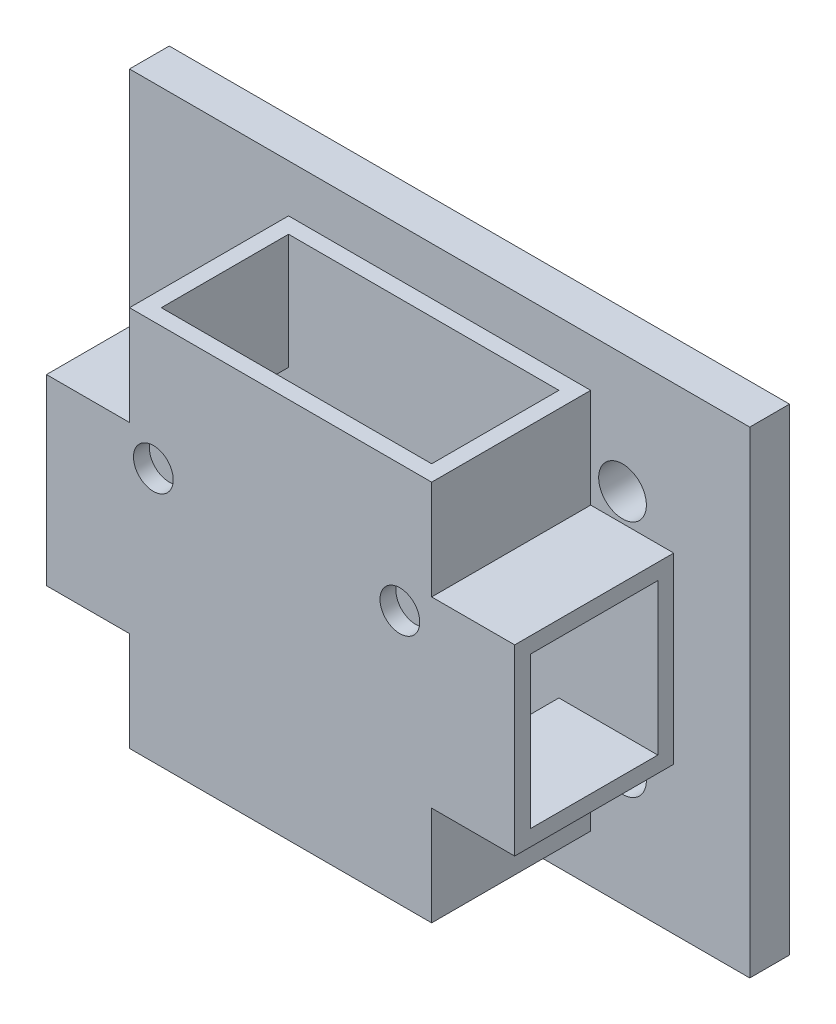
ISO-10303-21;
HEADER;
FILE_DESCRIPTION(('STEP AP214'),'2;1');
FILE_NAME('part.step','',(''),(''),'','','');
FILE_SCHEMA(('AUTOMOTIVE_DESIGN { 1 0 10303 214 1 1 1 1 }'));
ENDSEC;
DATA;
#1=APPLICATION_CONTEXT('core data for automotive mechanical design processes');
#2=APPLICATION_PROTOCOL_DEFINITION('international standard','automotive_design',2000,#1);
#3=PRODUCT_CONTEXT('',#1,'mechanical');
#4=PRODUCT('Part','Part','',(#3));
#5=PRODUCT_RELATED_PRODUCT_CATEGORY('part','',(#4));
#6=PRODUCT_DEFINITION_FORMATION('','',#4);
#7=PRODUCT_DEFINITION_CONTEXT('part definition',#1,'design');
#8=PRODUCT_DEFINITION('design','',#6,#7);
#9=PRODUCT_DEFINITION_SHAPE('','',#8);
#10=(LENGTH_UNIT() NAMED_UNIT(*) SI_UNIT(.MILLI.,.METRE.));
#11=(NAMED_UNIT(*) PLANE_ANGLE_UNIT() SI_UNIT($,.RADIAN.));
#12=(NAMED_UNIT(*) SI_UNIT($,.STERADIAN.) SOLID_ANGLE_UNIT());
#13=UNCERTAINTY_MEASURE_WITH_UNIT(LENGTH_MEASURE(1.E-05),#10,'distance_accuracy_value','');
#14=(GEOMETRIC_REPRESENTATION_CONTEXT(3) GLOBAL_UNCERTAINTY_ASSIGNED_CONTEXT((#13)) GLOBAL_UNIT_ASSIGNED_CONTEXT((#10,
#11,#12)) REPRESENTATION_CONTEXT('',''));
#15=CARTESIAN_POINT('',(0.,0.,0.));
#16=DIRECTION('',(0.,0.,1.));
#17=DIRECTION('',(1.,0.,0.));
#18=AXIS2_PLACEMENT_3D('',#15,#16,#17);
#19=CARTESIAN_POINT('',(30.3481827051708,-0.393732970027243,7.));
#20=DIRECTION('',(0.,-1.,0.));
#21=DIRECTION('',(1.,0.,0.));
#22=AXIS2_PLACEMENT_3D('',#19,#20,#21);
#23=PLANE('',#22);
#24=DIRECTION('',(-1.,0.,0.));
#25=VECTOR('',#24,1.);
#26=CARTESIAN_POINT('',(30.3481827051708,-0.393732970027243,7.));
#27=LINE('',#26,#25);
#28=CARTESIAN_POINT('',(29.2267491749382,-0.393732970027243,7.));
#29=VERTEX_POINT('',#28);
#30=CARTESIAN_POINT('',(16.7874659400545,-0.393732970027254,7.));
#31=VERTEX_POINT('',#30);
#32=EDGE_CURVE('E337',#29,#31,#27,.T.);
#33=ORIENTED_EDGE('',*,*,#32,.T.);
#34=DIRECTION('',(0.,0.,1.));
#35=VECTOR('',#34,1.);
#36=CARTESIAN_POINT('',(16.7874659400545,-0.393732970027245,7.00000000000001));
#37=LINE('',#36,#35);
#38=CARTESIAN_POINT('',(16.7874659400545,-0.393732970027247,23.));
#39=VERTEX_POINT('',#38);
#40=EDGE_CURVE('E313',#31,#39,#37,.T.);
#41=ORIENTED_EDGE('',*,*,#40,.T.);
#42=DIRECTION('',(-1.,0.,0.));
#43=VECTOR('',#42,1.);
#44=CARTESIAN_POINT('',(30.3481827051708,-0.393732970027243,23.));
#45=LINE('',#44,#43);
#46=CARTESIAN_POINT('',(29.2267491749382,-0.393732970027243,23.));
#47=VERTEX_POINT('',#46);
#48=EDGE_CURVE('E332',#47,#39,#45,.T.);
#49=ORIENTED_EDGE('',*,*,#48,.F.);
#50=DIRECTION('',(0.,0.,1.));
#51=VECTOR('',#50,1.);
#52=CARTESIAN_POINT('',(29.2267491749382,-0.393732970027243,25.));
#53=LINE('',#52,#51);
#54=EDGE_CURVE('E484',#29,#47,#53,.T.);
#55=ORIENTED_EDGE('',*,*,#54,.F.);
#56=EDGE_LOOP('',(#33,#41,#49,#55));
#57=FACE_BOUND('',#56,.T.);
#58=ADVANCED_FACE('F38',(#57),#23,.F.);
#59=CARTESIAN_POINT('',(30.3481827051708,18.6062670299728,7.));
#60=DIRECTION('',(0.,1.,0.));
#61=DIRECTION('',(-1.,0.,0.));
#62=AXIS2_PLACEMENT_3D('',#59,#60,#61);
#63=PLANE('',#62);
#64=DIRECTION('',(-1.,0.,0.));
#65=VECTOR('',#64,1.);
#66=CARTESIAN_POINT('',(30.3481827051708,18.6062670299728,23.));
#67=LINE('',#66,#65);
#68=CARTESIAN_POINT('',(29.2267491749382,18.6062670299728,23.));
#69=VERTEX_POINT('',#68);
#70=CARTESIAN_POINT('',(16.7882782751708,18.6062670299728,23.));
#71=VERTEX_POINT('',#70);
#72=EDGE_CURVE('E266',#69,#71,#67,.T.);
#73=ORIENTED_EDGE('',*,*,#72,.T.);
#74=DIRECTION('',(0.,0.,1.));
#75=VECTOR('',#74,1.);
#76=CARTESIAN_POINT('',(16.7882782751708,18.6062670299728,16.));
#77=LINE('',#76,#75);
#78=CARTESIAN_POINT('',(16.7882782751708,18.6062670299728,16.));
#79=VERTEX_POINT('',#78);
#80=EDGE_CURVE('E257',#71,#79,#77,.F.);
#81=ORIENTED_EDGE('',*,*,#80,.T.);
#82=DIRECTION('',(1.,0.,0.));
#83=VECTOR('',#82,1.);
#84=CARTESIAN_POINT('',(30.3481827051708,18.6062670299728,16.));
#85=LINE('',#84,#83);
#86=CARTESIAN_POINT('',(16.7874659400545,18.6062670299727,16.));
#87=VERTEX_POINT('',#86);
#88=EDGE_CURVE('E246',#87,#79,#85,.T.);
#89=ORIENTED_EDGE('',*,*,#88,.F.);
#90=DIRECTION('',(0.,0.,-1.));
#91=VECTOR('',#90,1.);
#92=CARTESIAN_POINT('',(16.7874659400545,18.6062670299728,7.));
#93=LINE('',#92,#91);
#94=CARTESIAN_POINT('',(16.7874659400545,18.6062670299727,7.));
#95=VERTEX_POINT('',#94);
#96=EDGE_CURVE('E493',#87,#95,#93,.T.);
#97=ORIENTED_EDGE('',*,*,#96,.T.);
#98=DIRECTION('',(-1.,0.,0.));
#99=VECTOR('',#98,1.);
#100=CARTESIAN_POINT('',(30.3481827051708,18.6062670299728,7.));
#101=LINE('',#100,#99);
#102=CARTESIAN_POINT('',(29.2267491749382,18.6062670299728,7.));
#103=VERTEX_POINT('',#102);
#104=EDGE_CURVE('E341',#103,#95,#101,.T.);
#105=ORIENTED_EDGE('',*,*,#104,.F.);
#106=DIRECTION('',(0.,0.,-1.));
#107=VECTOR('',#106,1.);
#108=CARTESIAN_POINT('',(29.2267491749382,18.6062670299728,25.));
#109=LINE('',#108,#107);
#110=EDGE_CURVE('E478',#69,#103,#109,.T.);
#111=ORIENTED_EDGE('',*,*,#110,.F.);
#112=EDGE_LOOP('',(#73,#81,#89,#97,#105,#111));
#113=FACE_BOUND('',#112,.T.);
#114=ADVANCED_FACE('F264',(#113),#63,.F.);
#115=CARTESIAN_POINT('',(0.,0.,5.));
#116=DIRECTION('',(0.,0.,1.));
#117=DIRECTION('',(1.,0.,0.));
#118=AXIS2_PLACEMENT_3D('',#115,#116,#117);
#119=PLANE('',#118);
#120=CARTESIAN_POINT('',(-23.2125340599455,24.1062670299727,5.));
#121=DIRECTION('',(0.,0.,1.));
#122=DIRECTION('',(1.,0.,0.));
#123=AXIS2_PLACEMENT_3D('',#120,#121,#122);
#124=CIRCLE('',#123,3.);
#125=CARTESIAN_POINT('',(-20.2125340599455,24.1062670299727,5.));
#126=VERTEX_POINT('',#125);
#127=EDGE_CURVE('E431',#126,#126,#124,.T.);
#128=ORIENTED_EDGE('',*,*,#127,.F.);
#129=EDGE_LOOP('',(#128));
#130=FACE_BOUND('',#129,.T.);
#131=CARTESIAN_POINT('',(22.7874659400545,-5.89373297002725,5.));
#132=DIRECTION('',(0.,0.,1.));
#133=DIRECTION('',(1.,0.,0.));
#134=AXIS2_PLACEMENT_3D('',#131,#132,#133);
#135=CIRCLE('',#134,3.);
#136=CARTESIAN_POINT('',(25.7874659400545,-5.89373297002725,5.));
#137=VERTEX_POINT('',#136);
#138=EDGE_CURVE('E438',#137,#137,#135,.T.);
#139=ORIENTED_EDGE('',*,*,#138,.F.);
#140=EDGE_LOOP('',(#139));
#141=FACE_BOUND('',#140,.T.);
#142=CARTESIAN_POINT('',(-23.2125340599455,-5.89373297002725,5.));
#143=DIRECTION('',(0.,0.,1.));
#144=DIRECTION('',(1.,0.,0.));
#145=AXIS2_PLACEMENT_3D('',#142,#143,#144);
#146=CIRCLE('',#145,3.);
#147=CARTESIAN_POINT('',(-20.2125340599455,-5.89373297002725,5.));
#148=VERTEX_POINT('',#147);
#149=EDGE_CURVE('E425',#148,#148,#146,.T.);
#150=ORIENTED_EDGE('',*,*,#149,.F.);
#151=EDGE_LOOP('',(#150));
#152=FACE_BOUND('',#151,.T.);
#153=CARTESIAN_POINT('',(22.7874659400545,24.1062670299727,5.));
#154=DIRECTION('',(0.,0.,1.));
#155=DIRECTION('',(1.,0.,0.));
#156=AXIS2_PLACEMENT_3D('',#153,#154,#155);
#157=CIRCLE('',#156,3.);
#158=CARTESIAN_POINT('',(25.7874659400545,24.1062670299727,5.));
#159=VERTEX_POINT('',#158);
#160=EDGE_CURVE('E434',#159,#159,#157,.T.);
#161=ORIENTED_EDGE('',*,*,#160,.F.);
#162=EDGE_LOOP('',(#161));
#163=FACE_BOUND('',#162,.T.);
#164=DIRECTION('',(0.,-1.,0.));
#165=VECTOR('',#164,1.);
#166=CARTESIAN_POINT('',(-39.2125340599455,39.1062670299727,5.));
#167=LINE('',#166,#165);
#168=CARTESIAN_POINT('',(-39.2125340599455,39.1062670299727,5.));
#169=VERTEX_POINT('',#168);
#170=CARTESIAN_POINT('',(-39.2125340599455,-20.8937329700273,5.));
#171=VERTEX_POINT('',#170);
#172=EDGE_CURVE('E449',#169,#171,#167,.T.);
#173=ORIENTED_EDGE('',*,*,#172,.T.);
#174=DIRECTION('',(1.,0.,0.));
#175=VECTOR('',#174,1.);
#176=CARTESIAN_POINT('',(-39.2125340599455,-20.8937329700273,5.));
#177=LINE('',#176,#175);
#178=CARTESIAN_POINT('',(38.7874659400545,-20.8937329700273,5.));
#179=VERTEX_POINT('',#178);
#180=EDGE_CURVE('E452',#171,#179,#177,.T.);
#181=ORIENTED_EDGE('',*,*,#180,.T.);
#182=DIRECTION('',(0.,1.,0.));
#183=VECTOR('',#182,1.);
#184=CARTESIAN_POINT('',(38.7874659400545,39.1062670299727,5.));
#185=LINE('',#184,#183);
#186=CARTESIAN_POINT('',(38.7874659400545,39.1062670299727,5.));
#187=VERTEX_POINT('',#186);
#188=EDGE_CURVE('E455',#179,#187,#185,.T.);
#189=ORIENTED_EDGE('',*,*,#188,.T.);
#190=DIRECTION('',(-1.,0.,0.));
#191=VECTOR('',#190,1.);
#192=CARTESIAN_POINT('',(-39.2125340599455,39.1062670299727,5.));
#193=LINE('',#192,#191);
#194=EDGE_CURVE('E457',#187,#169,#193,.T.);
#195=ORIENTED_EDGE('',*,*,#194,.T.);
#196=EDGE_LOOP('',(#173,#181,#189,#195));
#197=FACE_BOUND('',#196,.T.);
#198=DIRECTION('',(0.,1.,0.));
#199=VECTOR('',#198,1.);
#200=CARTESIAN_POINT('',(18.7874659400545,33.1062670299727,5.));
#201=LINE('',#200,#199);
#202=CARTESIAN_POINT('',(18.7874659400545,20.6062670299727,5.));
#203=VERTEX_POINT('',#202);
#204=CARTESIAN_POINT('',(18.7874659400545,33.1062670299727,5.));
#205=VERTEX_POINT('',#204);
#206=EDGE_CURVE('E388',#203,#205,#201,.T.);
#207=ORIENTED_EDGE('',*,*,#206,.F.);
#208=DIRECTION('',(-1.,0.,0.));
#209=VECTOR('',#208,1.);
#210=CARTESIAN_POINT('',(-29.6518172948292,20.6062670299727,5.));
#211=LINE('',#210,#209);
#212=CARTESIAN_POINT('',(29.2267491749382,20.6062670299727,5.));
#213=VERTEX_POINT('',#212);
#214=EDGE_CURVE('E362',#213,#203,#211,.T.);
#215=ORIENTED_EDGE('',*,*,#214,.F.);
#216=DIRECTION('',(0.,1.,0.));
#217=VECTOR('',#216,1.);
#218=CARTESIAN_POINT('',(29.2267491749382,20.6062670299727,5.));
#219=LINE('',#218,#217);
#220=CARTESIAN_POINT('',(29.2267491749382,-2.39373297002725,5.));
#221=VERTEX_POINT('',#220);
#222=EDGE_CURVE('E335',#221,#213,#219,.T.);
#223=ORIENTED_EDGE('',*,*,#222,.F.);
#224=DIRECTION('',(1.,0.,0.));
#225=VECTOR('',#224,1.);
#226=CARTESIAN_POINT('',(-29.6518172948292,-2.39373297002725,5.));
#227=LINE('',#226,#225);
#228=CARTESIAN_POINT('',(18.7874659400545,-2.39373297002725,5.));
#229=VERTEX_POINT('',#228);
#230=EDGE_CURVE('E366',#229,#221,#227,.T.);
#231=ORIENTED_EDGE('',*,*,#230,.F.);
#232=CARTESIAN_POINT('',(18.7874659400545,-14.8937329700273,5.));
#233=VERTEX_POINT('',#232);
#234=EDGE_CURVE('E402',#233,#229,#201,.T.);
#235=ORIENTED_EDGE('',*,*,#234,.F.);
#236=DIRECTION('',(1.,0.,0.));
#237=VECTOR('',#236,1.);
#238=CARTESIAN_POINT('',(-19.2125340599455,-14.8937329700273,5.));
#239=LINE('',#238,#237);
#240=CARTESIAN_POINT('',(-19.2125340599455,-14.8937329700273,5.));
#241=VERTEX_POINT('',#240);
#242=EDGE_CURVE('E411',#241,#233,#239,.T.);
#243=ORIENTED_EDGE('',*,*,#242,.F.);
#244=DIRECTION('',(0.,-1.,0.));
#245=VECTOR('',#244,1.);
#246=CARTESIAN_POINT('',(-19.2125340599455,33.1062670299727,5.));
#247=LINE('',#246,#245);
#248=CARTESIAN_POINT('',(-19.2125340599455,-2.39373297002725,5.));
#249=VERTEX_POINT('',#248);
#250=EDGE_CURVE('E407',#249,#241,#247,.T.);
#251=ORIENTED_EDGE('',*,*,#250,.F.);
#252=CARTESIAN_POINT('',(-29.6518172948292,-2.39373297002725,5.));
#253=VERTEX_POINT('',#252);
#254=EDGE_CURVE('E350',#253,#249,#227,.T.);
#255=ORIENTED_EDGE('',*,*,#254,.F.);
#256=DIRECTION('',(0.,-1.,0.));
#257=VECTOR('',#256,1.);
#258=CARTESIAN_POINT('',(-29.6518172948292,20.6062670299727,5.));
#259=LINE('',#258,#257);
#260=CARTESIAN_POINT('',(-29.6518172948292,20.6062670299727,5.));
#261=VERTEX_POINT('',#260);
#262=EDGE_CURVE('E364',#261,#253,#259,.T.);
#263=ORIENTED_EDGE('',*,*,#262,.F.);
#264=CARTESIAN_POINT('',(-19.2125340599455,20.6062670299727,5.));
#265=VERTEX_POINT('',#264);
#266=EDGE_CURVE('E361',#265,#261,#211,.T.);
#267=ORIENTED_EDGE('',*,*,#266,.F.);
#268=CARTESIAN_POINT('',(-19.2125340599455,33.1062670299727,5.));
#269=VERTEX_POINT('',#268);
#270=EDGE_CURVE('E408',#269,#265,#247,.T.);
#271=ORIENTED_EDGE('',*,*,#270,.F.);
#272=DIRECTION('',(-1.,0.,0.));
#273=VECTOR('',#272,1.);
#274=CARTESIAN_POINT('',(-19.2125340599455,33.1062670299727,5.));
#275=LINE('',#274,#273);
#276=EDGE_CURVE('E405',#205,#269,#275,.T.);
#277=ORIENTED_EDGE('',*,*,#276,.F.);
#278=EDGE_LOOP('',(#207,#215,#223,#231,#235,#243,#251,#255,#263,#267,#271,#277));
#279=FACE_BOUND('',#278,.T.);
#280=ADVANCED_FACE('F574',(#130,#141,#152,#163,#197,#279),#119,.T.);
#281=CARTESIAN_POINT('',(18.7874659400545,33.1062670299727,25.));
#282=DIRECTION('',(-1.,0.,0.));
#283=DIRECTION('',(0.,-1.,0.));
#284=AXIS2_PLACEMENT_3D('',#281,#282,#283);
#285=PLANE('',#284);
#286=DIRECTION('',(0.,0.,1.));
#287=VECTOR('',#286,1.);
#288=CARTESIAN_POINT('',(18.7874659400545,20.6062670299727,25.));
#289=LINE('',#288,#287);
#290=CARTESIAN_POINT('',(18.7874659400545,20.6062670299727,25.));
#291=VERTEX_POINT('',#290);
#292=EDGE_CURVE('E385',#203,#291,#289,.T.);
#293=ORIENTED_EDGE('',*,*,#292,.F.);
#294=ORIENTED_EDGE('',*,*,#206,.T.);
#295=DIRECTION('',(0.,0.,-1.));
#296=VECTOR('',#295,1.);
#297=CARTESIAN_POINT('',(18.7874659400545,33.1062670299727,25.));
#298=LINE('',#297,#296);
#299=CARTESIAN_POINT('',(18.7874659400545,33.1062670299727,25.));
#300=VERTEX_POINT('',#299);
#301=EDGE_CURVE('E421',#300,#205,#298,.T.);
#302=ORIENTED_EDGE('',*,*,#301,.F.);
#303=DIRECTION('',(0.,1.,0.));
#304=VECTOR('',#303,1.);
#305=CARTESIAN_POINT('',(18.7874659400545,33.1062670299727,25.));
#306=LINE('',#305,#304);
#307=EDGE_CURVE('E393',#291,#300,#306,.T.);
#308=ORIENTED_EDGE('',*,*,#307,.F.);
#309=EDGE_LOOP('',(#293,#294,#302,#308));
#310=FACE_BOUND('',#309,.T.);
#311=ADVANCED_FACE('F600',(#310),#285,.F.);
#312=DIRECTION('',(0.,0.,-1.));
#313=VECTOR('',#312,1.);
#314=CARTESIAN_POINT('',(18.7874659400545,-2.39373297002726,25.));
#315=LINE('',#314,#313);
#316=CARTESIAN_POINT('',(18.7874659400545,-2.39373297002725,25.));
#317=VERTEX_POINT('',#316);
#318=EDGE_CURVE('E381',#317,#229,#315,.T.);
#319=ORIENTED_EDGE('',*,*,#318,.F.);
#320=CARTESIAN_POINT('',(18.7874659400545,-14.8937329700273,25.));
#321=VERTEX_POINT('',#320);
#322=EDGE_CURVE('E389',#321,#317,#306,.T.);
#323=ORIENTED_EDGE('',*,*,#322,.F.);
#324=DIRECTION('',(0.,0.,-1.));
#325=VECTOR('',#324,1.);
#326=CARTESIAN_POINT('',(18.7874659400545,-14.8937329700273,25.));
#327=LINE('',#326,#325);
#328=EDGE_CURVE('E401',#321,#233,#327,.T.);
#329=ORIENTED_EDGE('',*,*,#328,.T.);
#330=ORIENTED_EDGE('',*,*,#234,.T.);
#331=EDGE_LOOP('',(#319,#323,#329,#330));
#332=FACE_BOUND('',#331,.T.);
#333=ADVANCED_FACE('F610',(#332),#285,.F.);
#334=CARTESIAN_POINT('',(-19.2125340599455,33.1062670299727,25.));
#335=DIRECTION('',(1.,0.,0.));
#336=DIRECTION('',(0.,1.,0.));
#337=AXIS2_PLACEMENT_3D('',#334,#335,#336);
#338=PLANE('',#337);
#339=DIRECTION('',(0.,0.,-1.));
#340=VECTOR('',#339,1.);
#341=CARTESIAN_POINT('',(-19.2125340599455,20.6062670299727,25.));
#342=LINE('',#341,#340);
#343=CARTESIAN_POINT('',(-19.2125340599455,20.6062670299727,25.));
#344=VERTEX_POINT('',#343);
#345=EDGE_CURVE('E383',#344,#265,#342,.T.);
#346=ORIENTED_EDGE('',*,*,#345,.F.);
#347=DIRECTION('',(0.,-1.,0.));
#348=VECTOR('',#347,1.);
#349=CARTESIAN_POINT('',(-19.2125340599455,33.1062670299727,25.));
#350=LINE('',#349,#348);
#351=CARTESIAN_POINT('',(-19.2125340599455,33.1062670299727,25.));
#352=VERTEX_POINT('',#351);
#353=EDGE_CURVE('E396',#352,#344,#350,.T.);
#354=ORIENTED_EDGE('',*,*,#353,.F.);
#355=DIRECTION('',(0.,0.,-1.));
#356=VECTOR('',#355,1.);
#357=CARTESIAN_POINT('',(-19.2125340599455,33.1062670299727,25.));
#358=LINE('',#357,#356);
#359=EDGE_CURVE('E418',#352,#269,#358,.T.);
#360=ORIENTED_EDGE('',*,*,#359,.T.);
#361=ORIENTED_EDGE('',*,*,#270,.T.);
#362=EDGE_LOOP('',(#346,#354,#360,#361));
#363=FACE_BOUND('',#362,.T.);
#364=ADVANCED_FACE('F592',(#363),#338,.F.);
#365=DIRECTION('',(0.,0.,1.));
#366=VECTOR('',#365,1.);
#367=CARTESIAN_POINT('',(-19.2125340599455,-2.39373297002726,25.));
#368=LINE('',#367,#366);
#369=CARTESIAN_POINT('',(-19.2125340599455,-2.39373297002726,25.));
#370=VERTEX_POINT('',#369);
#371=EDGE_CURVE('E378',#249,#370,#368,.T.);
#372=ORIENTED_EDGE('',*,*,#371,.F.);
#373=ORIENTED_EDGE('',*,*,#250,.T.);
#374=DIRECTION('',(0.,0.,-1.));
#375=VECTOR('',#374,1.);
#376=CARTESIAN_POINT('',(-19.2125340599455,-14.8937329700273,25.));
#377=LINE('',#376,#375);
#378=CARTESIAN_POINT('',(-19.2125340599455,-14.8937329700273,25.));
#379=VERTEX_POINT('',#378);
#380=EDGE_CURVE('E415',#379,#241,#377,.T.);
#381=ORIENTED_EDGE('',*,*,#380,.F.);
#382=EDGE_CURVE('E395',#370,#379,#350,.T.);
#383=ORIENTED_EDGE('',*,*,#382,.F.);
#384=EDGE_LOOP('',(#372,#373,#381,#383));
#385=FACE_BOUND('',#384,.T.);
#386=ADVANCED_FACE('F579',(#385),#338,.F.);
#387=CARTESIAN_POINT('',(-39.2125340599455,39.1062670299727,5.));
#388=DIRECTION('',(1.,0.,0.));
#389=DIRECTION('',(0.,0.,-1.));
#390=AXIS2_PLACEMENT_3D('',#387,#388,#389);
#391=PLANE('',#390);
#392=DIRECTION('',(0.,-1.,0.));
#393=VECTOR('',#392,1.);
#394=CARTESIAN_POINT('',(-39.2125340599455,39.1062670299727,0.));
#395=LINE('',#394,#393);
#396=CARTESIAN_POINT('',(-39.2125340599455,39.1062670299727,0.));
#397=VERTEX_POINT('',#396);
#398=CARTESIAN_POINT('',(-39.2125340599455,-20.8937329700273,0.));
#399=VERTEX_POINT('',#398);
#400=EDGE_CURVE('E446',#397,#399,#395,.T.);
#401=ORIENTED_EDGE('',*,*,#400,.T.);
#402=DIRECTION('',(0.,0.,-1.));
#403=VECTOR('',#402,1.);
#404=CARTESIAN_POINT('',(-39.2125340599455,-20.8937329700273,5.));
#405=LINE('',#404,#403);
#406=EDGE_CURVE('E475',#171,#399,#405,.T.);
#407=ORIENTED_EDGE('',*,*,#406,.F.);
#408=ORIENTED_EDGE('',*,*,#172,.F.);
#409=DIRECTION('',(0.,0.,-1.));
#410=VECTOR('',#409,1.);
#411=CARTESIAN_POINT('',(-39.2125340599455,39.1062670299727,5.));
#412=LINE('',#411,#410);
#413=EDGE_CURVE('E459',#169,#397,#412,.T.);
#414=ORIENTED_EDGE('',*,*,#413,.T.);
#415=EDGE_LOOP('',(#401,#407,#408,#414));
#416=FACE_BOUND('',#415,.T.);
#417=ADVANCED_FACE('F40',(#416),#391,.F.);
#418=CARTESIAN_POINT('',(-39.2125340599455,-20.8937329700273,5.));
#419=DIRECTION('',(0.,1.,0.));
#420=DIRECTION('',(0.,0.,1.));
#421=AXIS2_PLACEMENT_3D('',#418,#419,#420);
#422=PLANE('',#421);
#423=DIRECTION('',(1.,0.,0.));
#424=VECTOR('',#423,1.);
#425=CARTESIAN_POINT('',(-39.2125340599455,-20.8937329700273,0.));
#426=LINE('',#425,#424);
#427=CARTESIAN_POINT('',(38.7874659400545,-20.8937329700273,0.));
#428=VERTEX_POINT('',#427);
#429=EDGE_CURVE('E462',#399,#428,#426,.T.);
#430=ORIENTED_EDGE('',*,*,#429,.T.);
#431=DIRECTION('',(0.,0.,-1.));
#432=VECTOR('',#431,1.);
#433=CARTESIAN_POINT('',(38.7874659400545,-20.8937329700273,5.));
#434=LINE('',#433,#432);
#435=EDGE_CURVE('E472',#179,#428,#434,.T.);
#436=ORIENTED_EDGE('',*,*,#435,.F.);
#437=ORIENTED_EDGE('',*,*,#180,.F.);
#438=ORIENTED_EDGE('',*,*,#406,.T.);
#439=EDGE_LOOP('',(#430,#436,#437,#438));
#440=FACE_BOUND('',#439,.T.);
#441=ADVANCED_FACE('F926',(#440),#422,.F.);
#442=CARTESIAN_POINT('',(38.7874659400545,39.1062670299727,5.));
#443=DIRECTION('',(-1.,0.,0.));
#444=DIRECTION('',(0.,-1.,0.));
#445=AXIS2_PLACEMENT_3D('',#442,#443,#444);
#446=PLANE('',#445);
#447=DIRECTION('',(0.,1.,0.));
#448=VECTOR('',#447,1.);
#449=CARTESIAN_POINT('',(38.7874659400545,39.1062670299727,0.));
#450=LINE('',#449,#448);
#451=CARTESIAN_POINT('',(38.7874659400545,39.1062670299727,0.));
#452=VERTEX_POINT('',#451);
#453=EDGE_CURVE('E464',#428,#452,#450,.T.);
#454=ORIENTED_EDGE('',*,*,#453,.T.);
#455=DIRECTION('',(0.,0.,-1.));
#456=VECTOR('',#455,1.);
#457=CARTESIAN_POINT('',(38.7874659400545,39.1062670299727,5.));
#458=LINE('',#457,#456);
#459=EDGE_CURVE('E469',#187,#452,#458,.T.);
#460=ORIENTED_EDGE('',*,*,#459,.F.);
#461=ORIENTED_EDGE('',*,*,#188,.F.);
#462=ORIENTED_EDGE('',*,*,#435,.T.);
#463=EDGE_LOOP('',(#454,#460,#461,#462));
#464=FACE_BOUND('',#463,.T.);
#465=ADVANCED_FACE('F916',(#464),#446,.F.);
#466=CARTESIAN_POINT('',(-39.2125340599455,39.1062670299727,5.));
#467=DIRECTION('',(0.,-1.,0.));
#468=DIRECTION('',(0.,0.,-1.));
#469=AXIS2_PLACEMENT_3D('',#466,#467,#468);
#470=PLANE('',#469);
#471=DIRECTION('',(-1.,0.,0.));
#472=VECTOR('',#471,1.);
#473=CARTESIAN_POINT('',(-39.2125340599455,39.1062670299727,0.));
#474=LINE('',#473,#472);
#475=EDGE_CURVE('E453',#452,#397,#474,.T.);
#476=ORIENTED_EDGE('',*,*,#475,.T.);
#477=ORIENTED_EDGE('',*,*,#413,.F.);
#478=ORIENTED_EDGE('',*,*,#194,.F.);
#479=ORIENTED_EDGE('',*,*,#459,.T.);
#480=EDGE_LOOP('',(#476,#477,#478,#479));
#481=FACE_BOUND('',#480,.T.);
#482=ADVANCED_FACE('F906',(#481),#470,.F.);
#483=CARTESIAN_POINT('',(0.,0.,0.));
#484=DIRECTION('',(0.,0.,1.));
#485=DIRECTION('',(1.,0.,0.));
#486=AXIS2_PLACEMENT_3D('',#483,#484,#485);
#487=PLANE('',#486);
#488=CARTESIAN_POINT('',(-23.2125340599455,24.1062670299727,0.));
#489=DIRECTION('',(0.,0.,1.));
#490=DIRECTION('',(1.,0.,0.));
#491=AXIS2_PLACEMENT_3D('',#488,#489,#490);
#492=CIRCLE('',#491,3.);
#493=CARTESIAN_POINT('',(-20.2125340599455,24.1062670299727,0.));
#494=VERTEX_POINT('',#493);
#495=EDGE_CURVE('E435',#494,#494,#492,.T.);
#496=ORIENTED_EDGE('',*,*,#495,.T.);
#497=EDGE_LOOP('',(#496));
#498=FACE_BOUND('',#497,.T.);
#499=CARTESIAN_POINT('',(22.7874659400545,-5.89373297002725,0.));
#500=DIRECTION('',(0.,0.,1.));
#501=DIRECTION('',(1.,0.,0.));
#502=AXIS2_PLACEMENT_3D('',#499,#500,#501);
#503=CIRCLE('',#502,3.);
#504=CARTESIAN_POINT('',(25.7874659400545,-5.89373297002725,0.));
#505=VERTEX_POINT('',#504);
#506=EDGE_CURVE('E428',#505,#505,#503,.T.);
#507=ORIENTED_EDGE('',*,*,#506,.T.);
#508=EDGE_LOOP('',(#507));
#509=FACE_BOUND('',#508,.T.);
#510=CARTESIAN_POINT('',(-23.2125340599455,-5.89373297002725,0.));
#511=DIRECTION('',(0.,0.,1.));
#512=DIRECTION('',(1.,0.,0.));
#513=AXIS2_PLACEMENT_3D('',#510,#511,#512);
#514=CIRCLE('',#513,3.);
#515=CARTESIAN_POINT('',(-20.2125340599455,-5.89373297002725,0.));
#516=VERTEX_POINT('',#515);
#517=EDGE_CURVE('E424',#516,#516,#514,.T.);
#518=ORIENTED_EDGE('',*,*,#517,.T.);
#519=EDGE_LOOP('',(#518));
#520=FACE_BOUND('',#519,.T.);
#521=CARTESIAN_POINT('',(22.7874659400545,24.1062670299727,0.));
#522=DIRECTION('',(0.,0.,1.));
#523=DIRECTION('',(1.,0.,0.));
#524=AXIS2_PLACEMENT_3D('',#521,#522,#523);
#525=CIRCLE('',#524,3.);
#526=CARTESIAN_POINT('',(25.7874659400545,24.1062670299727,0.));
#527=VERTEX_POINT('',#526);
#528=EDGE_CURVE('E443',#527,#527,#525,.T.);
#529=ORIENTED_EDGE('',*,*,#528,.T.);
#530=EDGE_LOOP('',(#529));
#531=FACE_BOUND('',#530,.T.);
#532=ORIENTED_EDGE('',*,*,#400,.F.);
#533=ORIENTED_EDGE('',*,*,#475,.F.);
#534=ORIENTED_EDGE('',*,*,#453,.F.);
#535=ORIENTED_EDGE('',*,*,#429,.F.);
#536=EDGE_LOOP('',(#532,#533,#534,#535));
#537=FACE_BOUND('',#536,.T.);
#538=ADVANCED_FACE('F896',(#498,#509,#520,#531,#537),#487,.F.);
#539=CARTESIAN_POINT('',(22.7874659400545,24.1062670299727,0.));
#540=DIRECTION('',(0.,0.,1.));
#541=DIRECTION('',(1.,0.,0.));
#542=AXIS2_PLACEMENT_3D('',#539,#540,#541);
#543=CYLINDRICAL_SURFACE('',#542,3.);
#544=ORIENTED_EDGE('',*,*,#528,.F.);
#545=EDGE_LOOP('',(#544));
#546=FACE_BOUND('',#545,.T.);
#547=ORIENTED_EDGE('',*,*,#160,.T.);
#548=EDGE_LOOP('',(#547));
#549=FACE_BOUND('',#548,.T.);
#550=ADVANCED_FACE('F886',(#546,#549),#543,.F.);
#551=CARTESIAN_POINT('',(-23.2125340599455,-5.89373297002725,0.));
#552=DIRECTION('',(0.,0.,1.));
#553=DIRECTION('',(1.,0.,0.));
#554=AXIS2_PLACEMENT_3D('',#551,#552,#553);
#555=CYLINDRICAL_SURFACE('',#554,3.);
#556=ORIENTED_EDGE('',*,*,#517,.F.);
#557=EDGE_LOOP('',(#556));
#558=FACE_BOUND('',#557,.T.);
#559=ORIENTED_EDGE('',*,*,#149,.T.);
#560=EDGE_LOOP('',(#559));
#561=FACE_BOUND('',#560,.T.);
#562=ADVANCED_FACE('F876',(#558,#561),#555,.F.);
#563=CARTESIAN_POINT('',(22.7874659400545,-5.89373297002725,0.));
#564=DIRECTION('',(0.,0.,1.));
#565=DIRECTION('',(1.,0.,0.));
#566=AXIS2_PLACEMENT_3D('',#563,#564,#565);
#567=CYLINDRICAL_SURFACE('',#566,3.);
#568=ORIENTED_EDGE('',*,*,#506,.F.);
#569=EDGE_LOOP('',(#568));
#570=FACE_BOUND('',#569,.T.);
#571=ORIENTED_EDGE('',*,*,#138,.T.);
#572=EDGE_LOOP('',(#571));
#573=FACE_BOUND('',#572,.T.);
#574=ADVANCED_FACE('F867',(#570,#573),#567,.F.);
#575=CARTESIAN_POINT('',(-23.2125340599455,24.1062670299727,0.));
#576=DIRECTION('',(0.,0.,1.));
#577=DIRECTION('',(1.,0.,0.));
#578=AXIS2_PLACEMENT_3D('',#575,#576,#577);
#579=CYLINDRICAL_SURFACE('',#578,3.);
#580=ORIENTED_EDGE('',*,*,#495,.F.);
#581=EDGE_LOOP('',(#580));
#582=FACE_BOUND('',#581,.T.);
#583=ORIENTED_EDGE('',*,*,#127,.T.);
#584=EDGE_LOOP('',(#583));
#585=FACE_BOUND('',#584,.T.);
#586=ADVANCED_FACE('F859',(#582,#585),#579,.F.);
#587=CARTESIAN_POINT('',(-19.2125340599455,33.1062670299727,25.));
#588=DIRECTION('',(0.,-1.,0.));
#589=DIRECTION('',(0.,0.,-1.));
#590=AXIS2_PLACEMENT_3D('',#587,#588,#589);
#591=PLANE('',#590);
#592=DIRECTION('',(1.,0.,0.));
#593=VECTOR('',#592,1.);
#594=CARTESIAN_POINT('',(-19.2125340599455,33.1062670299727,7.));
#595=LINE('',#594,#593);
#596=CARTESIAN_POINT('',(-17.2125340599455,33.1062670299727,7.));
#597=VERTEX_POINT('',#596);
#598=CARTESIAN_POINT('',(16.7874659400545,33.1062670299727,7.));
#599=VERTEX_POINT('',#598);
#600=EDGE_CURVE('E310',#597,#599,#595,.T.);
#601=ORIENTED_EDGE('',*,*,#600,.T.);
#602=DIRECTION('',(0.,0.,1.));
#603=VECTOR('',#602,1.);
#604=CARTESIAN_POINT('',(16.7874659400545,33.1062670299727,25.));
#605=LINE('',#604,#603);
#606=CARTESIAN_POINT('',(16.7874659400545,33.1062670299727,23.));
#607=VERTEX_POINT('',#606);
#608=EDGE_CURVE('E316',#599,#607,#605,.T.);
#609=ORIENTED_EDGE('',*,*,#608,.T.);
#610=DIRECTION('',(-1.,0.,0.));
#611=VECTOR('',#610,1.);
#612=CARTESIAN_POINT('',(-19.2125340599455,33.1062670299727,23.));
#613=LINE('',#612,#611);
#614=CARTESIAN_POINT('',(-17.2125340599455,33.1062670299727,23.));
#615=VERTEX_POINT('',#614);
#616=EDGE_CURVE('E301',#607,#615,#613,.T.);
#617=ORIENTED_EDGE('',*,*,#616,.T.);
#618=DIRECTION('',(0.,0.,-1.));
#619=VECTOR('',#618,1.);
#620=CARTESIAN_POINT('',(-17.2125340599455,33.1062670299727,25.));
#621=LINE('',#620,#619);
#622=EDGE_CURVE('E307',#615,#597,#621,.T.);
#623=ORIENTED_EDGE('',*,*,#622,.T.);
#624=EDGE_LOOP('',(#601,#609,#617,#623));
#625=FACE_BOUND('',#624,.T.);
#626=ORIENTED_EDGE('',*,*,#276,.T.);
#627=ORIENTED_EDGE('',*,*,#359,.F.);
#628=DIRECTION('',(-1.,0.,0.));
#629=VECTOR('',#628,1.);
#630=CARTESIAN_POINT('',(-19.2125340599455,33.1062670299727,25.));
#631=LINE('',#630,#629);
#632=EDGE_CURVE('E392',#300,#352,#631,.T.);
#633=ORIENTED_EDGE('',*,*,#632,.F.);
#634=ORIENTED_EDGE('',*,*,#301,.T.);
#635=EDGE_LOOP('',(#626,#627,#633,#634));
#636=FACE_BOUND('',#635,.T.);
#637=ADVANCED_FACE('F523',(#625,#636),#591,.F.);
#638=CARTESIAN_POINT('',(-19.2125340599455,-14.8937329700273,25.));
#639=DIRECTION('',(0.,1.,0.));
#640=DIRECTION('',(0.,0.,1.));
#641=AXIS2_PLACEMENT_3D('',#638,#639,#640);
#642=PLANE('',#641);
#643=DIRECTION('',(-1.,0.,0.));
#644=VECTOR('',#643,1.);
#645=CARTESIAN_POINT('',(-17.2125340599455,-14.8937329700273,23.));
#646=LINE('',#645,#644);
#647=CARTESIAN_POINT('',(16.7874659400545,-14.8937329700273,23.));
#648=VERTEX_POINT('',#647);
#649=CARTESIAN_POINT('',(-17.2125340599455,-14.8937329700273,23.));
#650=VERTEX_POINT('',#649);
#651=EDGE_CURVE('E279',#648,#650,#646,.T.);
#652=ORIENTED_EDGE('',*,*,#651,.F.);
#653=DIRECTION('',(0.,0.,1.));
#654=VECTOR('',#653,1.);
#655=CARTESIAN_POINT('',(16.7874659400545,-14.8937329700273,23.));
#656=LINE('',#655,#654);
#657=CARTESIAN_POINT('',(16.7874659400545,-14.8937329700273,7.));
#658=VERTEX_POINT('',#657);
#659=EDGE_CURVE('E277',#658,#648,#656,.T.);
#660=ORIENTED_EDGE('',*,*,#659,.F.);
#661=DIRECTION('',(1.,0.,0.));
#662=VECTOR('',#661,1.);
#663=CARTESIAN_POINT('',(-17.2125340599455,-14.8937329700273,7.));
#664=LINE('',#663,#662);
#665=CARTESIAN_POINT('',(-17.2125340599455,-14.8937329700273,7.));
#666=VERTEX_POINT('',#665);
#667=EDGE_CURVE('E285',#666,#658,#664,.T.);
#668=ORIENTED_EDGE('',*,*,#667,.F.);
#669=DIRECTION('',(0.,0.,-1.));
#670=VECTOR('',#669,1.);
#671=CARTESIAN_POINT('',(-17.2125340599455,-14.8937329700273,23.));
#672=LINE('',#671,#670);
#673=EDGE_CURVE('E282',#650,#666,#672,.T.);
#674=ORIENTED_EDGE('',*,*,#673,.F.);
#675=EDGE_LOOP('',(#652,#660,#668,#674));
#676=FACE_BOUND('',#675,.T.);
#677=ORIENTED_EDGE('',*,*,#242,.T.);
#678=ORIENTED_EDGE('',*,*,#328,.F.);
#679=DIRECTION('',(1.,0.,0.));
#680=VECTOR('',#679,1.);
#681=CARTESIAN_POINT('',(-19.2125340599455,-14.8937329700273,25.));
#682=LINE('',#681,#680);
#683=EDGE_CURVE('E399',#379,#321,#682,.T.);
#684=ORIENTED_EDGE('',*,*,#683,.F.);
#685=ORIENTED_EDGE('',*,*,#380,.T.);
#686=EDGE_LOOP('',(#677,#678,#684,#685));
#687=FACE_BOUND('',#686,.T.);
#688=ADVANCED_FACE('F542',(#676,#687),#642,.F.);
#689=CARTESIAN_POINT('',(0.,0.,25.));
#690=DIRECTION('',(0.,0.,1.));
#691=DIRECTION('',(1.,0.,0.));
#692=AXIS2_PLACEMENT_3D('',#689,#690,#691);
#693=PLANE('',#692);
#694=CARTESIAN_POINT('',(14.7882782751708,17.1062670299727,25.));
#695=DIRECTION('',(0.,0.,1.));
#696=DIRECTION('',(1.,0.,0.));
#697=AXIS2_PLACEMENT_3D('',#694,#695,#696);
#698=CIRCLE('',#697,2.49999999999999);
#699=CARTESIAN_POINT('',(17.2882782751708,17.1062670299727,25.));
#700=VERTEX_POINT('',#699);
#701=EDGE_CURVE('E261',#700,#700,#698,.T.);
#702=ORIENTED_EDGE('',*,*,#701,.F.);
#703=EDGE_LOOP('',(#702));
#704=FACE_BOUND('',#703,.T.);
#705=CARTESIAN_POINT('',(-16.2117217248292,17.1062670299727,25.));
#706=DIRECTION('',(0.,0.,1.));
#707=DIRECTION('',(1.,0.,0.));
#708=AXIS2_PLACEMENT_3D('',#705,#706,#707);
#709=CIRCLE('',#708,2.5);
#710=CARTESIAN_POINT('',(-13.7117217248292,17.1062670299727,25.));
#711=VERTEX_POINT('',#710);
#712=EDGE_CURVE('E502',#711,#711,#709,.T.);
#713=ORIENTED_EDGE('',*,*,#712,.F.);
#714=EDGE_LOOP('',(#713));
#715=FACE_BOUND('',#714,.T.);
#716=ORIENTED_EDGE('',*,*,#322,.T.);
#717=DIRECTION('',(1.,0.,0.));
#718=VECTOR('',#717,1.);
#719=CARTESIAN_POINT('',(-29.6518172948292,-2.39373297002725,25.));
#720=LINE('',#719,#718);
#721=CARTESIAN_POINT('',(29.2267491749382,-2.39373297002725,25.));
#722=VERTEX_POINT('',#721);
#723=EDGE_CURVE('E355',#317,#722,#720,.T.);
#724=ORIENTED_EDGE('',*,*,#723,.T.);
#725=DIRECTION('',(0.,1.,0.));
#726=VECTOR('',#725,1.);
#727=CARTESIAN_POINT('',(29.2267491749382,20.6062670299727,25.));
#728=LINE('',#727,#726);
#729=CARTESIAN_POINT('',(29.2267491749382,20.6062670299727,25.));
#730=VERTEX_POINT('',#729);
#731=EDGE_CURVE('E346',#722,#730,#728,.T.);
#732=ORIENTED_EDGE('',*,*,#731,.T.);
#733=DIRECTION('',(-1.,0.,0.));
#734=VECTOR('',#733,1.);
#735=CARTESIAN_POINT('',(-29.6518172948292,20.6062670299727,25.));
#736=LINE('',#735,#734);
#737=EDGE_CURVE('E351',#730,#291,#736,.T.);
#738=ORIENTED_EDGE('',*,*,#737,.T.);
#739=ORIENTED_EDGE('',*,*,#307,.T.);
#740=ORIENTED_EDGE('',*,*,#632,.T.);
#741=ORIENTED_EDGE('',*,*,#353,.T.);
#742=CARTESIAN_POINT('',(-29.6518172948292,20.6062670299727,25.));
#743=VERTEX_POINT('',#742);
#744=EDGE_CURVE('E349',#344,#743,#736,.T.);
#745=ORIENTED_EDGE('',*,*,#744,.T.);
#746=DIRECTION('',(0.,-1.,0.));
#747=VECTOR('',#746,1.);
#748=CARTESIAN_POINT('',(-29.6518172948292,20.6062670299727,25.));
#749=LINE('',#748,#747);
#750=CARTESIAN_POINT('',(-29.6518172948292,-2.39373297002725,25.));
#751=VERTEX_POINT('',#750);
#752=EDGE_CURVE('E353',#743,#751,#749,.T.);
#753=ORIENTED_EDGE('',*,*,#752,.T.);
#754=EDGE_CURVE('E356',#751,#370,#720,.T.);
#755=ORIENTED_EDGE('',*,*,#754,.T.);
#756=ORIENTED_EDGE('',*,*,#382,.T.);
#757=ORIENTED_EDGE('',*,*,#683,.T.);
#758=EDGE_LOOP('',(#716,#724,#732,#738,#739,#740,#741,#745,#753,#755,#756,#757));
#759=FACE_BOUND('',#758,.T.);
#760=ADVANCED_FACE('F585',(#704,#715,#759),#693,.T.);
#761=CARTESIAN_POINT('',(-29.6518172948292,-2.39373297002725,25.));
#762=DIRECTION('',(0.,1.,0.));
#763=DIRECTION('',(-1.,0.,0.));
#764=AXIS2_PLACEMENT_3D('',#761,#762,#763);
#765=PLANE('',#764);
#766=ORIENTED_EDGE('',*,*,#254,.T.);
#767=ORIENTED_EDGE('',*,*,#371,.T.);
#768=ORIENTED_EDGE('',*,*,#754,.F.);
#769=DIRECTION('',(0.,0.,-1.));
#770=VECTOR('',#769,1.);
#771=CARTESIAN_POINT('',(-29.6518172948292,-2.39373297002725,25.));
#772=LINE('',#771,#770);
#773=EDGE_CURVE('E370',#751,#253,#772,.T.);
#774=ORIENTED_EDGE('',*,*,#773,.T.);
#775=EDGE_LOOP('',(#766,#767,#768,#774));
#776=FACE_BOUND('',#775,.T.);
#777=ADVANCED_FACE('F570',(#776),#765,.F.);
#778=CARTESIAN_POINT('',(-29.6518172948292,20.6062670299727,25.));
#779=DIRECTION('',(0.,-1.,0.));
#780=DIRECTION('',(0.,0.,-1.));
#781=AXIS2_PLACEMENT_3D('',#778,#779,#780);
#782=PLANE('',#781);
#783=ORIENTED_EDGE('',*,*,#744,.F.);
#784=ORIENTED_EDGE('',*,*,#345,.T.);
#785=ORIENTED_EDGE('',*,*,#266,.T.);
#786=DIRECTION('',(0.,0.,-1.));
#787=VECTOR('',#786,1.);
#788=CARTESIAN_POINT('',(-29.6518172948292,20.6062670299727,25.));
#789=LINE('',#788,#787);
#790=EDGE_CURVE('E373',#743,#261,#789,.T.);
#791=ORIENTED_EDGE('',*,*,#790,.F.);
#792=EDGE_LOOP('',(#783,#784,#785,#791));
#793=FACE_BOUND('',#792,.T.);
#794=ADVANCED_FACE('F559',(#793),#782,.F.);
#795=CARTESIAN_POINT('',(-29.6518172948292,20.6062670299727,25.));
#796=DIRECTION('',(1.,0.,0.));
#797=DIRECTION('',(0.,1.,0.));
#798=AXIS2_PLACEMENT_3D('',#795,#796,#797);
#799=PLANE('',#798);
#800=DIRECTION('',(0.,0.,-1.));
#801=VECTOR('',#800,1.);
#802=CARTESIAN_POINT('',(-29.6518172948292,18.6062670299727,7.));
#803=LINE('',#802,#801);
#804=CARTESIAN_POINT('',(-29.6518172948292,18.6062670299727,23.));
#805=VERTEX_POINT('',#804);
#806=CARTESIAN_POINT('',(-29.6518172948292,18.6062670299727,7.));
#807=VERTEX_POINT('',#806);
#808=EDGE_CURVE('E322',#805,#807,#803,.T.);
#809=ORIENTED_EDGE('',*,*,#808,.F.);
#810=DIRECTION('',(0.,1.,0.));
#811=VECTOR('',#810,1.);
#812=CARTESIAN_POINT('',(-29.6518172948292,18.6062670299727,23.));
#813=LINE('',#812,#811);
#814=CARTESIAN_POINT('',(-29.6518172948292,-0.393732970027252,23.));
#815=VERTEX_POINT('',#814);
#816=EDGE_CURVE('E319',#815,#805,#813,.T.);
#817=ORIENTED_EDGE('',*,*,#816,.F.);
#818=DIRECTION('',(0.,0.,1.));
#819=VECTOR('',#818,1.);
#820=CARTESIAN_POINT('',(-29.6518172948292,-0.393732970027252,7.));
#821=LINE('',#820,#819);
#822=CARTESIAN_POINT('',(-29.6518172948292,-0.393732970027252,7.));
#823=VERTEX_POINT('',#822);
#824=EDGE_CURVE('E328',#823,#815,#821,.T.);
#825=ORIENTED_EDGE('',*,*,#824,.F.);
#826=DIRECTION('',(0.,-1.,0.));
#827=VECTOR('',#826,1.);
#828=CARTESIAN_POINT('',(-29.6518172948292,18.6062670299727,7.));
#829=LINE('',#828,#827);
#830=EDGE_CURVE('E325',#807,#823,#829,.T.);
#831=ORIENTED_EDGE('',*,*,#830,.F.);
#832=EDGE_LOOP('',(#809,#817,#825,#831));
#833=FACE_BOUND('',#832,.T.);
#834=ORIENTED_EDGE('',*,*,#262,.T.);
#835=ORIENTED_EDGE('',*,*,#773,.F.);
#836=ORIENTED_EDGE('',*,*,#752,.F.);
#837=ORIENTED_EDGE('',*,*,#790,.T.);
#838=EDGE_LOOP('',(#834,#835,#836,#837));
#839=FACE_BOUND('',#838,.T.);
#840=ADVANCED_FACE('F555',(#833,#839),#799,.F.);
#841=ORIENTED_EDGE('',*,*,#214,.T.);
#842=ORIENTED_EDGE('',*,*,#292,.T.);
#843=ORIENTED_EDGE('',*,*,#737,.F.);
#844=DIRECTION('',(0.,0.,-1.));
#845=VECTOR('',#844,1.);
#846=CARTESIAN_POINT('',(29.2267491749382,20.6062670299727,25.));
#847=LINE('',#846,#845);
#848=EDGE_CURVE('E376',#730,#213,#847,.T.);
#849=ORIENTED_EDGE('',*,*,#848,.T.);
#850=EDGE_LOOP('',(#841,#842,#843,#849));
#851=FACE_BOUND('',#850,.T.);
#852=ADVANCED_FACE('F558',(#851),#782,.F.);
#853=ORIENTED_EDGE('',*,*,#723,.F.);
#854=ORIENTED_EDGE('',*,*,#318,.T.);
#855=ORIENTED_EDGE('',*,*,#230,.T.);
#856=DIRECTION('',(0.,0.,-1.));
#857=VECTOR('',#856,1.);
#858=CARTESIAN_POINT('',(29.2267491749382,-2.39373297002725,25.));
#859=LINE('',#858,#857);
#860=EDGE_CURVE('E358',#722,#221,#859,.T.);
#861=ORIENTED_EDGE('',*,*,#860,.F.);
#862=EDGE_LOOP('',(#853,#854,#855,#861));
#863=FACE_BOUND('',#862,.T.);
#864=ADVANCED_FACE('F611',(#863),#765,.F.);
#865=CARTESIAN_POINT('',(29.2267491749382,20.6062670299727,25.));
#866=DIRECTION('',(-1.,0.,0.));
#867=DIRECTION('',(0.,-1.,0.));
#868=AXIS2_PLACEMENT_3D('',#865,#866,#867);
#869=PLANE('',#868);
#870=ORIENTED_EDGE('',*,*,#54,.T.);
#871=DIRECTION('',(0.,1.,0.));
#872=VECTOR('',#871,1.);
#873=CARTESIAN_POINT('',(29.2267491749382,20.6062670299727,23.));
#874=LINE('',#873,#872);
#875=EDGE_CURVE('E487',#47,#69,#874,.T.);
#876=ORIENTED_EDGE('',*,*,#875,.T.);
#877=ORIENTED_EDGE('',*,*,#110,.T.);
#878=DIRECTION('',(0.,-1.,0.));
#879=VECTOR('',#878,1.);
#880=CARTESIAN_POINT('',(29.2267491749382,20.6062670299727,7.));
#881=LINE('',#880,#879);
#882=EDGE_CURVE('E481',#103,#29,#881,.T.);
#883=ORIENTED_EDGE('',*,*,#882,.T.);
#884=EDGE_LOOP('',(#870,#876,#877,#883));
#885=FACE_BOUND('',#884,.T.);
#886=ORIENTED_EDGE('',*,*,#222,.T.);
#887=ORIENTED_EDGE('',*,*,#848,.F.);
#888=ORIENTED_EDGE('',*,*,#731,.F.);
#889=ORIENTED_EDGE('',*,*,#860,.T.);
#890=EDGE_LOOP('',(#886,#887,#888,#889));
#891=FACE_BOUND('',#890,.T.);
#892=ADVANCED_FACE('F529',(#885,#891),#869,.F.);
#893=CARTESIAN_POINT('',(30.3481827051708,18.6062670299728,23.));
#894=DIRECTION('',(0.,0.,1.));
#895=DIRECTION('',(0.,-1.,0.));
#896=AXIS2_PLACEMENT_3D('',#893,#894,#895);
#897=PLANE('',#896);
#898=DIRECTION('',(0.,-1.,0.));
#899=VECTOR('',#898,1.);
#900=CARTESIAN_POINT('',(16.7874659400545,45.1062670299728,23.));
#901=LINE('',#900,#899);
#902=CARTESIAN_POINT('',(16.7874659400545,18.6073495328941,23.));
#903=VERTEX_POINT('',#902);
#904=EDGE_CURVE('E298',#607,#903,#901,.T.);
#905=ORIENTED_EDGE('',*,*,#904,.T.);
#906=CARTESIAN_POINT('',(14.7882782751708,17.1062670299727,23.));
#907=DIRECTION('',(0.,0.,1.));
#908=DIRECTION('',(0.,-1.,0.));
#909=AXIS2_PLACEMENT_3D('',#906,#907,#908);
#910=CIRCLE('',#909,2.49999999999999);
#911=EDGE_CURVE('E253',#903,#71,#910,.T.);
#912=ORIENTED_EDGE('',*,*,#911,.T.);
#913=ORIENTED_EDGE('',*,*,#72,.F.);
#914=ORIENTED_EDGE('',*,*,#875,.F.);
#915=ORIENTED_EDGE('',*,*,#48,.T.);
#916=EDGE_CURVE('E288',#39,#648,#901,.T.);
#917=ORIENTED_EDGE('',*,*,#916,.T.);
#918=ORIENTED_EDGE('',*,*,#651,.T.);
#919=DIRECTION('',(0.,-1.,0.));
#920=VECTOR('',#919,1.);
#921=CARTESIAN_POINT('',(-17.2125340599455,45.1062670299728,23.));
#922=LINE('',#921,#920);
#923=CARTESIAN_POINT('',(-17.2125340599455,-0.39373297002725,23.));
#924=VERTEX_POINT('',#923);
#925=EDGE_CURVE('E296',#924,#650,#922,.T.);
#926=ORIENTED_EDGE('',*,*,#925,.F.);
#927=EDGE_CURVE('E336',#924,#815,#45,.T.);
#928=ORIENTED_EDGE('',*,*,#927,.T.);
#929=ORIENTED_EDGE('',*,*,#816,.T.);
#930=CARTESIAN_POINT('',(-18.2117217248292,18.6062670299727,23.));
#931=VERTEX_POINT('',#930);
#932=EDGE_CURVE('E331',#931,#805,#67,.T.);
#933=ORIENTED_EDGE('',*,*,#932,.F.);
#934=CARTESIAN_POINT('',(-16.2117217248292,17.1062670299727,23.));
#935=DIRECTION('',(0.,0.,1.));
#936=DIRECTION('',(0.,-1.,0.));
#937=AXIS2_PLACEMENT_3D('',#934,#935,#936);
#938=CIRCLE('',#937,2.5);
#939=CARTESIAN_POINT('',(-17.2125340599455,19.3972001738857,23.));
#940=VERTEX_POINT('',#939);
#941=EDGE_CURVE('E268',#931,#940,#938,.T.);
#942=ORIENTED_EDGE('',*,*,#941,.T.);
#943=EDGE_CURVE('E295',#615,#940,#922,.T.);
#944=ORIENTED_EDGE('',*,*,#943,.F.);
#945=ORIENTED_EDGE('',*,*,#616,.F.);
#946=EDGE_LOOP('',(#905,#912,#913,#914,#915,#917,#918,#926,#928,#929,#933,#942,#944,#945));
#947=FACE_BOUND('',#946,.T.);
#948=ADVANCED_FACE('F510',(#947),#897,.F.);
#949=ORIENTED_EDGE('',*,*,#927,.F.);
#950=DIRECTION('',(0.,0.,-1.));
#951=VECTOR('',#950,1.);
#952=CARTESIAN_POINT('',(-17.2125340599455,-0.39373297002725,6.99999999999999));
#953=LINE('',#952,#951);
#954=CARTESIAN_POINT('',(-17.2125340599455,-0.393732970027254,7.));
#955=VERTEX_POINT('',#954);
#956=EDGE_CURVE('E304',#924,#955,#953,.T.);
#957=ORIENTED_EDGE('',*,*,#956,.T.);
#958=EDGE_CURVE('E340',#955,#823,#27,.T.);
#959=ORIENTED_EDGE('',*,*,#958,.T.);
#960=ORIENTED_EDGE('',*,*,#824,.T.);
#961=EDGE_LOOP('',(#949,#957,#959,#960));
#962=FACE_BOUND('',#961,.T.);
#963=ADVANCED_FACE('F552',(#962),#23,.F.);
#964=CARTESIAN_POINT('',(30.3481827051708,18.6062670299728,7.));
#965=DIRECTION('',(0.,0.,-1.));
#966=DIRECTION('',(0.,1.,0.));
#967=AXIS2_PLACEMENT_3D('',#964,#965,#966);
#968=PLANE('',#967);
#969=ORIENTED_EDGE('',*,*,#958,.F.);
#970=DIRECTION('',(0.,-1.,0.));
#971=VECTOR('',#970,1.);
#972=CARTESIAN_POINT('',(-17.2125340599455,45.1062670299728,7.));
#973=LINE('',#972,#971);
#974=EDGE_CURVE('E293',#955,#666,#973,.T.);
#975=ORIENTED_EDGE('',*,*,#974,.T.);
#976=ORIENTED_EDGE('',*,*,#667,.T.);
#977=DIRECTION('',(0.,-1.,0.));
#978=VECTOR('',#977,1.);
#979=CARTESIAN_POINT('',(16.7874659400545,45.1062670299728,7.));
#980=LINE('',#979,#978);
#981=EDGE_CURVE('E289',#31,#658,#980,.T.);
#982=ORIENTED_EDGE('',*,*,#981,.F.);
#983=ORIENTED_EDGE('',*,*,#32,.F.);
#984=ORIENTED_EDGE('',*,*,#882,.F.);
#985=ORIENTED_EDGE('',*,*,#104,.T.);
#986=EDGE_CURVE('E291',#599,#95,#980,.T.);
#987=ORIENTED_EDGE('',*,*,#986,.F.);
#988=ORIENTED_EDGE('',*,*,#600,.F.);
#989=CARTESIAN_POINT('',(-17.2125340599455,18.6062670299727,7.));
#990=VERTEX_POINT('',#989);
#991=EDGE_CURVE('E292',#597,#990,#973,.T.);
#992=ORIENTED_EDGE('',*,*,#991,.T.);
#993=EDGE_CURVE('E344',#990,#807,#101,.T.);
#994=ORIENTED_EDGE('',*,*,#993,.T.);
#995=ORIENTED_EDGE('',*,*,#830,.T.);
#996=EDGE_LOOP('',(#969,#975,#976,#982,#983,#984,#985,#987,#988,#992,#994,#995));
#997=FACE_BOUND('',#996,.T.);
#998=ADVANCED_FACE('F519',(#997),#968,.F.);
#999=DIRECTION('',(1.,0.,0.));
#1000=VECTOR('',#999,1.);
#1001=CARTESIAN_POINT('',(30.3481827051708,18.6062670299728,16.));
#1002=LINE('',#1001,#1000);
#1003=CARTESIAN_POINT('',(-18.2117217248292,18.6062670299727,16.));
#1004=VERTEX_POINT('',#1003);
#1005=CARTESIAN_POINT('',(-17.2125340599455,18.6062670299727,16.));
#1006=VERTEX_POINT('',#1005);
#1007=EDGE_CURVE('E53',#1004,#1006,#1002,.T.);
#1008=ORIENTED_EDGE('',*,*,#1007,.F.);
#1009=DIRECTION('',(0.,0.,1.));
#1010=VECTOR('',#1009,1.);
#1011=CARTESIAN_POINT('',(-18.2117217248292,18.6062670299727,16.));
#1012=LINE('',#1011,#1010);
#1013=EDGE_CURVE('E274',#1004,#931,#1012,.T.);
#1014=ORIENTED_EDGE('',*,*,#1013,.T.);
#1015=ORIENTED_EDGE('',*,*,#932,.T.);
#1016=ORIENTED_EDGE('',*,*,#808,.T.);
#1017=ORIENTED_EDGE('',*,*,#993,.F.);
#1018=DIRECTION('',(0.,0.,1.));
#1019=VECTOR('',#1018,1.);
#1020=CARTESIAN_POINT('',(-17.2125340599455,18.6062670299727,6.99999999999999));
#1021=LINE('',#1020,#1019);
#1022=EDGE_CURVE('E490',#990,#1006,#1021,.T.);
#1023=ORIENTED_EDGE('',*,*,#1022,.T.);
#1024=EDGE_LOOP('',(#1008,#1014,#1015,#1016,#1017,#1023));
#1025=FACE_BOUND('',#1024,.T.);
#1026=ADVANCED_FACE('F514',(#1025),#63,.F.);
#1027=CARTESIAN_POINT('',(-17.2125340599455,45.1062670299728,23.));
#1028=DIRECTION('',(-1.,0.,0.));
#1029=DIRECTION('',(0.,0.,1.));
#1030=AXIS2_PLACEMENT_3D('',#1027,#1028,#1029);
#1031=PLANE('',#1030);
#1032=ORIENTED_EDGE('',*,*,#943,.T.);
#1033=DIRECTION('',(0.,0.,1.));
#1034=VECTOR('',#1033,1.);
#1035=CARTESIAN_POINT('',(-17.2125340599455,19.3972001738857,16.));
#1036=LINE('',#1035,#1034);
#1037=CARTESIAN_POINT('',(-17.2125340599455,19.3972001738857,16.));
#1038=VERTEX_POINT('',#1037);
#1039=EDGE_CURVE('E11',#940,#1038,#1036,.F.);
#1040=ORIENTED_EDGE('',*,*,#1039,.T.);
#1041=DIRECTION('',(0.,1.,0.));
#1042=VECTOR('',#1041,1.);
#1043=CARTESIAN_POINT('',(-17.2125340599455,45.1062670299728,16.));
#1044=LINE('',#1043,#1042);
#1045=EDGE_CURVE('E46',#1006,#1038,#1044,.T.);
#1046=ORIENTED_EDGE('',*,*,#1045,.F.);
#1047=ORIENTED_EDGE('',*,*,#1022,.F.);
#1048=ORIENTED_EDGE('',*,*,#991,.F.);
#1049=ORIENTED_EDGE('',*,*,#622,.F.);
#1050=EDGE_LOOP('',(#1032,#1040,#1046,#1047,#1048,#1049));
#1051=FACE_BOUND('',#1050,.T.);
#1052=ADVANCED_FACE('F505',(#1051),#1031,.F.);
#1053=CARTESIAN_POINT('',(16.7874659400545,45.1062670299728,23.));
#1054=DIRECTION('',(1.,0.,0.));
#1055=DIRECTION('',(0.,0.,-1.));
#1056=AXIS2_PLACEMENT_3D('',#1053,#1054,#1055);
#1057=PLANE('',#1056);
#1058=DIRECTION('',(0.,-1.,0.));
#1059=VECTOR('',#1058,1.);
#1060=CARTESIAN_POINT('',(16.7874659400545,45.1062670299728,16.));
#1061=LINE('',#1060,#1059);
#1062=CARTESIAN_POINT('',(16.7874659400545,18.6073495328941,16.));
#1063=VERTEX_POINT('',#1062);
#1064=EDGE_CURVE('E249',#1063,#87,#1061,.T.);
#1065=ORIENTED_EDGE('',*,*,#1064,.F.);
#1066=DIRECTION('',(0.,0.,1.));
#1067=VECTOR('',#1066,1.);
#1068=CARTESIAN_POINT('',(16.7874659400545,18.6073495328941,16.));
#1069=LINE('',#1068,#1067);
#1070=EDGE_CURVE('E260',#1063,#903,#1069,.T.);
#1071=ORIENTED_EDGE('',*,*,#1070,.T.);
#1072=ORIENTED_EDGE('',*,*,#904,.F.);
#1073=ORIENTED_EDGE('',*,*,#608,.F.);
#1074=ORIENTED_EDGE('',*,*,#986,.T.);
#1075=ORIENTED_EDGE('',*,*,#96,.F.);
#1076=EDGE_LOOP('',(#1065,#1071,#1072,#1073,#1074,#1075));
#1077=FACE_BOUND('',#1076,.T.);
#1078=ADVANCED_FACE('F526',(#1077),#1057,.F.);
#1079=ORIENTED_EDGE('',*,*,#981,.T.);
#1080=ORIENTED_EDGE('',*,*,#659,.T.);
#1081=ORIENTED_EDGE('',*,*,#916,.F.);
#1082=ORIENTED_EDGE('',*,*,#40,.F.);
#1083=EDGE_LOOP('',(#1079,#1080,#1081,#1082));
#1084=FACE_BOUND('',#1083,.T.);
#1085=ADVANCED_FACE('F538',(#1084),#1057,.F.);
#1086=ORIENTED_EDGE('',*,*,#925,.T.);
#1087=ORIENTED_EDGE('',*,*,#673,.T.);
#1088=ORIENTED_EDGE('',*,*,#974,.F.);
#1089=ORIENTED_EDGE('',*,*,#956,.F.);
#1090=EDGE_LOOP('',(#1086,#1087,#1088,#1089));
#1091=FACE_BOUND('',#1090,.T.);
#1092=ADVANCED_FACE('F545',(#1091),#1031,.F.);
#1093=CARTESIAN_POINT('',(14.7882782751708,17.1062670299727,16.));
#1094=DIRECTION('',(0.,0.,1.));
#1095=DIRECTION('',(1.,0.,0.));
#1096=AXIS2_PLACEMENT_3D('',#1093,#1094,#1095);
#1097=CYLINDRICAL_SURFACE('',#1096,2.49999999999999);
#1098=ORIENTED_EDGE('',*,*,#701,.T.);
#1099=EDGE_LOOP('',(#1098));
#1100=FACE_BOUND('',#1099,.T.);
#1101=ORIENTED_EDGE('',*,*,#911,.F.);
#1102=ORIENTED_EDGE('',*,*,#1070,.F.);
#1103=CARTESIAN_POINT('',(14.7882782751708,17.1062670299727,16.));
#1104=DIRECTION('',(0.,0.,1.));
#1105=DIRECTION('',(1.,0.,0.));
#1106=AXIS2_PLACEMENT_3D('',#1103,#1104,#1105);
#1107=CIRCLE('',#1106,2.49999999999999);
#1108=EDGE_CURVE('E61',#79,#1063,#1107,.T.);
#1109=ORIENTED_EDGE('',*,*,#1108,.F.);
#1110=ORIENTED_EDGE('',*,*,#80,.F.);
#1111=EDGE_LOOP('',(#1101,#1102,#1109,#1110));
#1112=FACE_BOUND('',#1111,.T.);
#1113=ADVANCED_FACE('F256',(#1100,#1112),#1097,.F.);
#1114=CARTESIAN_POINT('',(14.7882782751708,17.1062670299727,16.));
#1115=DIRECTION('',(0.,0.,1.));
#1116=DIRECTION('',(1.,0.,0.));
#1117=AXIS2_PLACEMENT_3D('',#1114,#1115,#1116);
#1118=PLANE('',#1117);
#1119=ORIENTED_EDGE('',*,*,#88,.T.);
#1120=ORIENTED_EDGE('',*,*,#1108,.T.);
#1121=ORIENTED_EDGE('',*,*,#1064,.T.);
#1122=EDGE_LOOP('',(#1119,#1120,#1121));
#1123=FACE_BOUND('',#1122,.T.);
#1124=ADVANCED_FACE('F247',(#1123),#1118,.T.);
#1125=CARTESIAN_POINT('',(-16.2117217248292,17.1062670299727,16.));
#1126=DIRECTION('',(0.,0.,1.));
#1127=DIRECTION('',(1.,0.,0.));
#1128=AXIS2_PLACEMENT_3D('',#1125,#1126,#1127);
#1129=CYLINDRICAL_SURFACE('',#1128,2.5);
#1130=ORIENTED_EDGE('',*,*,#712,.T.);
#1131=EDGE_LOOP('',(#1130));
#1132=FACE_BOUND('',#1131,.T.);
#1133=CARTESIAN_POINT('',(-16.2117217248292,17.1062670299727,16.));
#1134=DIRECTION('',(0.,0.,1.));
#1135=DIRECTION('',(1.,0.,0.));
#1136=AXIS2_PLACEMENT_3D('',#1133,#1134,#1135);
#1137=CIRCLE('',#1136,2.5);
#1138=EDGE_CURVE('E498',#1038,#1004,#1137,.T.);
#1139=ORIENTED_EDGE('',*,*,#1138,.F.);
#1140=ORIENTED_EDGE('',*,*,#1039,.F.);
#1141=ORIENTED_EDGE('',*,*,#941,.F.);
#1142=ORIENTED_EDGE('',*,*,#1013,.F.);
#1143=EDGE_LOOP('',(#1139,#1140,#1141,#1142));
#1144=FACE_BOUND('',#1143,.T.);
#1145=ADVANCED_FACE('F501',(#1132,#1144),#1129,.F.);
#1146=CARTESIAN_POINT('',(-16.2117217248292,17.1062670299727,16.));
#1147=DIRECTION('',(0.,0.,1.));
#1148=DIRECTION('',(1.,0.,0.));
#1149=AXIS2_PLACEMENT_3D('',#1146,#1147,#1148);
#1150=PLANE('',#1149);
#1151=ORIENTED_EDGE('',*,*,#1007,.T.);
#1152=ORIENTED_EDGE('',*,*,#1045,.T.);
#1153=ORIENTED_EDGE('',*,*,#1138,.T.);
#1154=EDGE_LOOP('',(#1151,#1152,#1153));
#1155=FACE_BOUND('',#1154,.T.);
#1156=ADVANCED_FACE('F497',(#1155),#1150,.T.);
#1157=CLOSED_SHELL('',(#58,#114,#280,#311,#333,#364,#386,#417,#441,#465,#482,#538,#550,#562,
#574,#586,#637,#688,#760,#777,#794,#840,#852,#864,#892,#948,#963,#998,#1026,#1052,#1078,#1085,
#1092,#1113,#1124,#1145,#1156));
#1158=MANIFOLD_SOLID_BREP('B2',#1157);
#1159=ADVANCED_BREP_SHAPE_REPRESENTATION('',(#18,#1158),#14);
#1160=SHAPE_DEFINITION_REPRESENTATION(#9,#1159);
ENDSEC;
END-ISO-10303-21;
